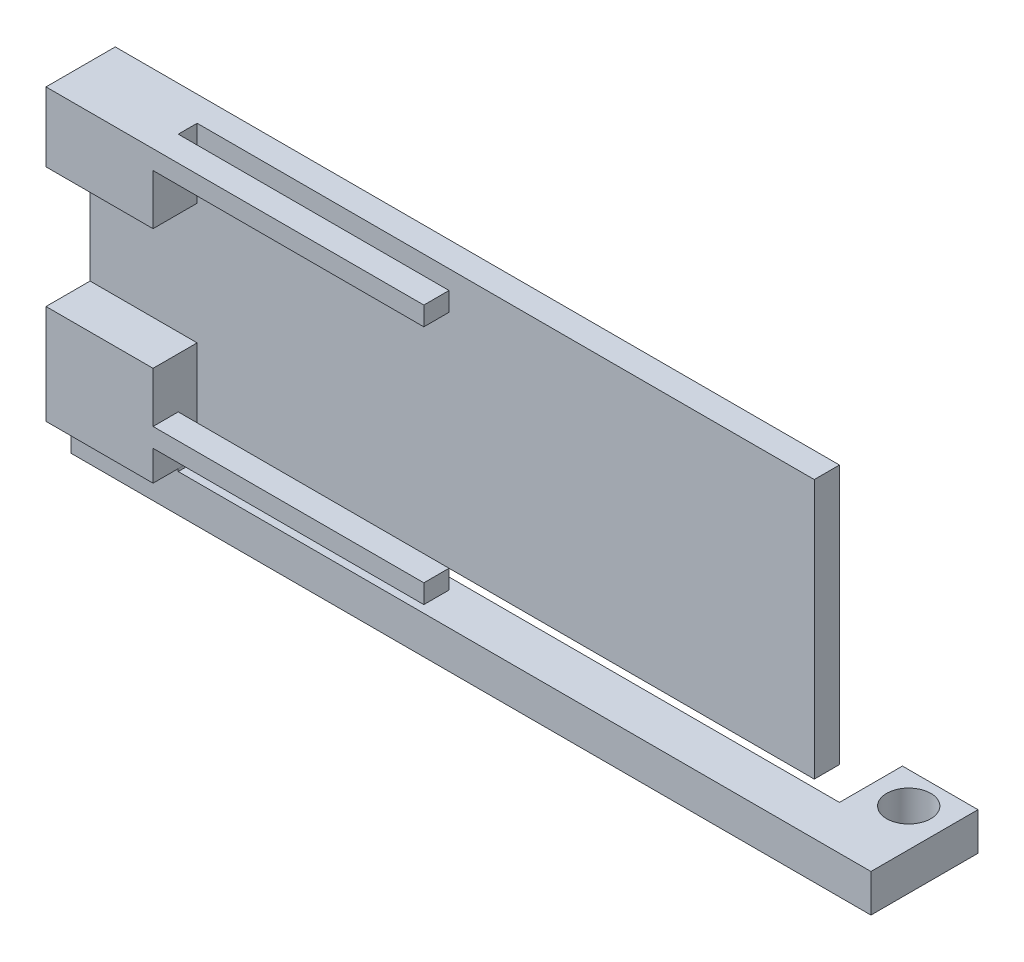
ISO-10303-21;
HEADER;
FILE_DESCRIPTION(('STEP AP214'),'2;1');
FILE_NAME('part.step','',(''),(''),'','','');
FILE_SCHEMA(('AUTOMOTIVE_DESIGN { 1 0 10303 214 1 1 1 1 }'));
ENDSEC;
DATA;
#1=APPLICATION_CONTEXT('core data for automotive mechanical design processes');
#2=APPLICATION_PROTOCOL_DEFINITION('international standard','automotive_design',2000,#1);
#3=PRODUCT_CONTEXT('',#1,'mechanical');
#4=PRODUCT('Part','Part','',(#3));
#5=PRODUCT_RELATED_PRODUCT_CATEGORY('part','',(#4));
#6=PRODUCT_DEFINITION_FORMATION('','',#4);
#7=PRODUCT_DEFINITION_CONTEXT('part definition',#1,'design');
#8=PRODUCT_DEFINITION('design','',#6,#7);
#9=PRODUCT_DEFINITION_SHAPE('','',#8);
#10=(LENGTH_UNIT() NAMED_UNIT(*) SI_UNIT(.MILLI.,.METRE.));
#11=(NAMED_UNIT(*) PLANE_ANGLE_UNIT() SI_UNIT($,.RADIAN.));
#12=(NAMED_UNIT(*) SI_UNIT($,.STERADIAN.) SOLID_ANGLE_UNIT());
#13=UNCERTAINTY_MEASURE_WITH_UNIT(LENGTH_MEASURE(1.E-05),#10,'distance_accuracy_value','');
#14=(GEOMETRIC_REPRESENTATION_CONTEXT(3) GLOBAL_UNCERTAINTY_ASSIGNED_CONTEXT((#13)) GLOBAL_UNIT_ASSIGNED_CONTEXT((#10,
#11,#12)) REPRESENTATION_CONTEXT('',''));
#15=CARTESIAN_POINT('',(0.,0.,0.));
#16=DIRECTION('',(0.,0.,1.));
#17=DIRECTION('',(1.,0.,0.));
#18=AXIS2_PLACEMENT_3D('',#15,#16,#17);
#19=CARTESIAN_POINT('',(0.,0.,0.));
#20=DIRECTION('',(0.,0.,1.));
#21=DIRECTION('',(1.,0.,0.));
#22=AXIS2_PLACEMENT_3D('',#19,#20,#21);
#23=PLANE('',#22);
#24=DIRECTION('',(0.,1.,0.));
#25=VECTOR('',#24,1.);
#26=CARTESIAN_POINT('',(32.9165410472493,-18.2131355932203,0.));
#27=LINE('',#26,#25);
#28=CARTESIAN_POINT('',(32.9165410472493,-18.2131355932203,0.));
#29=VERTEX_POINT('',#28);
#30=CARTESIAN_POINT('',(32.9165410472493,-15.2131355932203,0.));
#31=VERTEX_POINT('',#30);
#32=EDGE_CURVE('E155',#29,#31,#27,.T.);
#33=ORIENTED_EDGE('',*,*,#32,.F.);
#34=DIRECTION('',(-1.,0.,0.));
#35=VECTOR('',#34,1.);
#36=CARTESIAN_POINT('',(-24.5834589527507,-18.2131355932203,0.));
#37=LINE('',#36,#35);
#38=CARTESIAN_POINT('',(-16.0834589527507,-18.2131355932203,0.));
#39=VERTEX_POINT('',#38);
#40=EDGE_CURVE('E70',#29,#39,#37,.T.);
#41=ORIENTED_EDGE('',*,*,#40,.T.);
#42=DIRECTION('',(0.,-1.,0.));
#43=VECTOR('',#42,1.);
#44=CARTESIAN_POINT('',(-16.0834589527507,-18.2131355932203,0.));
#45=LINE('',#44,#43);
#46=CARTESIAN_POINT('',(-16.0834589527507,-15.2131355932203,0.));
#47=VERTEX_POINT('',#46);
#48=EDGE_CURVE('E173',#47,#39,#45,.T.);
#49=ORIENTED_EDGE('',*,*,#48,.F.);
#50=DIRECTION('',(1.,0.,0.));
#51=VECTOR('',#50,1.);
#52=CARTESIAN_POINT('',(-16.0834589527507,-15.2131355932203,0.));
#53=LINE('',#52,#51);
#54=EDGE_CURVE('E65',#47,#31,#53,.T.);
#55=ORIENTED_EDGE('',*,*,#54,.T.);
#56=EDGE_LOOP('',(#33,#41,#49,#55));
#57=FACE_BOUND('',#56,.T.);
#58=ADVANCED_FACE('F49',(#57),#23,.F.);
#59=DIRECTION('',(1.,0.,0.));
#60=VECTOR('',#59,1.);
#61=CARTESIAN_POINT('',(-24.5834589527507,-15.2131355932203,0.));
#62=LINE('',#61,#60);
#63=CARTESIAN_POINT('',(-24.5834589527507,-15.2131355932203,0.));
#64=VERTEX_POINT('',#63);
#65=EDGE_CURVE('E168',#64,#47,#62,.T.);
#66=ORIENTED_EDGE('',*,*,#65,.F.);
#67=DIRECTION('',(0.,1.,0.));
#68=VECTOR('',#67,1.);
#69=CARTESIAN_POINT('',(-24.5834589527507,-15.2131355932203,0.));
#70=LINE('',#69,#68);
#71=CARTESIAN_POINT('',(-24.5834589527507,-15.0131355932203,0.));
#72=VERTEX_POINT('',#71);
#73=EDGE_CURVE('E193',#64,#72,#70,.T.);
#74=ORIENTED_EDGE('',*,*,#73,.T.);
#75=DIRECTION('',(1.,0.,0.));
#76=VECTOR('',#75,1.);
#77=CARTESIAN_POINT('',(-16.0834589527507,-15.0131355932203,0.));
#78=LINE('',#77,#76);
#79=CARTESIAN_POINT('',(-16.0834589527507,-15.0131355932203,0.));
#80=VERTEX_POINT('',#79);
#81=EDGE_CURVE('E195',#72,#80,#78,.T.);
#82=ORIENTED_EDGE('',*,*,#81,.T.);
#83=DIRECTION('',(0.,-1.,0.));
#84=VECTOR('',#83,1.);
#85=CARTESIAN_POINT('',(-16.0834589527507,-15.0131355932203,0.));
#86=LINE('',#85,#84);
#87=EDGE_CURVE('E198',#80,#47,#86,.T.);
#88=ORIENTED_EDGE('',*,*,#87,.T.);
#89=EDGE_LOOP('',(#66,#74,#82,#88));
#90=FACE_BOUND('',#89,.T.);
#91=ADVANCED_FACE('F235',(#90),#23,.F.);
#92=CARTESIAN_POINT('',(-16.0834589527507,-15.0131355932203,0.));
#93=DIRECTION('',(0.,-1.,0.));
#94=DIRECTION('',(0.,0.,-1.));
#95=AXIS2_PLACEMENT_3D('',#92,#93,#94);
#96=PLANE('',#95);
#97=DIRECTION('',(1.,0.,0.));
#98=VECTOR('',#97,1.);
#99=CARTESIAN_POINT('',(-16.0834589527507,-15.0131355932203,3.5));
#100=LINE('',#99,#98);
#101=CARTESIAN_POINT('',(-24.5834589527507,-15.0131355932203,3.5));
#102=VERTEX_POINT('',#101);
#103=CARTESIAN_POINT('',(-16.0834589527507,-15.0131355932203,3.5));
#104=VERTEX_POINT('',#103);
#105=EDGE_CURVE('E192',#102,#104,#100,.T.);
#106=ORIENTED_EDGE('',*,*,#105,.T.);
#107=DIRECTION('',(0.,0.,1.));
#108=VECTOR('',#107,1.);
#109=CARTESIAN_POINT('',(-16.0834589527507,-15.0131355932203,0.));
#110=LINE('',#109,#108);
#111=EDGE_CURVE('E58',#80,#104,#110,.T.);
#112=ORIENTED_EDGE('',*,*,#111,.F.);
#113=ORIENTED_EDGE('',*,*,#81,.F.);
#114=DIRECTION('',(0.,0.,1.));
#115=VECTOR('',#114,1.);
#116=CARTESIAN_POINT('',(-24.5834589527507,-15.0131355932203,0.));
#117=LINE('',#116,#115);
#118=EDGE_CURVE('E12',#72,#102,#117,.T.);
#119=ORIENTED_EDGE('',*,*,#118,.T.);
#120=EDGE_LOOP('',(#106,#112,#113,#119));
#121=FACE_BOUND('',#120,.T.);
#122=ADVANCED_FACE('F51',(#121),#96,.F.);
#123=CARTESIAN_POINT('',(-16.0834589527507,-15.0131355932203,0.));
#124=DIRECTION('',(-1.,0.,0.));
#125=DIRECTION('',(0.,0.,1.));
#126=AXIS2_PLACEMENT_3D('',#123,#124,#125);
#127=PLANE('',#126);
#128=DIRECTION('',(0.,-1.,0.));
#129=VECTOR('',#128,1.);
#130=CARTESIAN_POINT('',(-16.0834589527507,-15.0131355932203,3.5));
#131=LINE('',#130,#129);
#132=CARTESIAN_POINT('',(-16.0834589527507,-15.2131355932203,3.5));
#133=VERTEX_POINT('',#132);
#134=EDGE_CURVE('E204',#104,#133,#131,.T.);
#135=ORIENTED_EDGE('',*,*,#134,.T.);
#136=DIRECTION('',(0.,0.,1.));
#137=VECTOR('',#136,1.);
#138=CARTESIAN_POINT('',(-16.0834589527507,-15.2131355932203,0.));
#139=LINE('',#138,#137);
#140=EDGE_CURVE('E215',#47,#133,#139,.T.);
#141=ORIENTED_EDGE('',*,*,#140,.F.);
#142=ORIENTED_EDGE('',*,*,#87,.F.);
#143=ORIENTED_EDGE('',*,*,#111,.T.);
#144=EDGE_LOOP('',(#135,#141,#142,#143));
#145=FACE_BOUND('',#144,.T.);
#146=ADVANCED_FACE('F223',(#145),#127,.F.);
#147=CARTESIAN_POINT('',(-16.0834589527507,-15.2131355932203,0.));
#148=DIRECTION('',(0.,-1.,0.));
#149=DIRECTION('',(1.,0.,0.));
#150=AXIS2_PLACEMENT_3D('',#147,#148,#149);
#151=PLANE('',#150);
#152=CARTESIAN_POINT('',(35.9165410472493,-15.2131355932203,-2.5));
#153=DIRECTION('',(0.,1.,0.));
#154=DIRECTION('',(0.,0.,1.));
#155=AXIS2_PLACEMENT_3D('',#152,#153,#154);
#156=CIRCLE('',#155,1.75);
#157=CARTESIAN_POINT('',(35.9165410472493,-15.2131355932203,-0.749999999999994));
#158=VERTEX_POINT('',#157);
#159=EDGE_CURVE('E279',#158,#158,#156,.T.);
#160=ORIENTED_EDGE('',*,*,#159,.F.);
#161=EDGE_LOOP('',(#160));
#162=FACE_BOUND('',#161,.T.);
#163=DIRECTION('',(1.,0.,0.));
#164=VECTOR('',#163,1.);
#165=CARTESIAN_POINT('',(-16.0834589527507,-15.2131355932203,3.5));
#166=LINE('',#165,#164);
#167=CARTESIAN_POINT('',(38.9165410472493,-15.2131355932203,3.5));
#168=VERTEX_POINT('',#167);
#169=EDGE_CURVE('E206',#133,#168,#166,.T.);
#170=ORIENTED_EDGE('',*,*,#169,.T.);
#171=DIRECTION('',(0.,0.,1.));
#172=VECTOR('',#171,1.);
#173=CARTESIAN_POINT('',(38.9165410472493,-15.2131355932203,0.));
#174=LINE('',#173,#172);
#175=CARTESIAN_POINT('',(38.9165410472493,-15.2131355932203,-5.));
#176=VERTEX_POINT('',#175);
#177=EDGE_CURVE('E139',#176,#168,#174,.T.);
#178=ORIENTED_EDGE('',*,*,#177,.F.);
#179=DIRECTION('',(1.,0.,0.));
#180=VECTOR('',#179,1.);
#181=CARTESIAN_POINT('',(38.9165410472493,-15.2131355932203,-5.));
#182=LINE('',#181,#180);
#183=CARTESIAN_POINT('',(32.9165410472493,-15.2131355932203,-5.));
#184=VERTEX_POINT('',#183);
#185=EDGE_CURVE('E154',#184,#176,#182,.T.);
#186=ORIENTED_EDGE('',*,*,#185,.F.);
#187=DIRECTION('',(0.,0.,1.));
#188=VECTOR('',#187,1.);
#189=CARTESIAN_POINT('',(32.9165410472493,-15.2131355932203,-5.));
#190=LINE('',#189,#188);
#191=EDGE_CURVE('E163',#184,#31,#190,.T.);
#192=ORIENTED_EDGE('',*,*,#191,.T.);
#193=ORIENTED_EDGE('',*,*,#54,.F.);
#194=ORIENTED_EDGE('',*,*,#140,.T.);
#195=EDGE_LOOP('',(#170,#178,#186,#192,#193,#194));
#196=FACE_BOUND('',#195,.T.);
#197=ADVANCED_FACE('F233',(#162,#196),#151,.F.);
#198=CARTESIAN_POINT('',(38.9165410472493,-15.2131355932203,0.));
#199=DIRECTION('',(-1.,0.,0.));
#200=DIRECTION('',(0.,-1.,0.));
#201=AXIS2_PLACEMENT_3D('',#198,#199,#200);
#202=PLANE('',#201);
#203=DIRECTION('',(0.,-1.,0.));
#204=VECTOR('',#203,1.);
#205=CARTESIAN_POINT('',(38.9165410472493,-15.2131355932203,3.5));
#206=LINE('',#205,#204);
#207=CARTESIAN_POINT('',(38.9165410472493,-18.2131355932203,3.5));
#208=VERTEX_POINT('',#207);
#209=EDGE_CURVE('E136',#168,#208,#206,.T.);
#210=ORIENTED_EDGE('',*,*,#209,.T.);
#211=DIRECTION('',(0.,0.,1.));
#212=VECTOR('',#211,1.);
#213=CARTESIAN_POINT('',(38.9165410472493,-18.2131355932203,0.));
#214=LINE('',#213,#212);
#215=CARTESIAN_POINT('',(38.9165410472493,-18.2131355932203,-5.));
#216=VERTEX_POINT('',#215);
#217=EDGE_CURVE('E129',#216,#208,#214,.T.);
#218=ORIENTED_EDGE('',*,*,#217,.F.);
#219=DIRECTION('',(0.,-1.,0.));
#220=VECTOR('',#219,1.);
#221=CARTESIAN_POINT('',(38.9165410472493,-18.2131355932203,-5.));
#222=LINE('',#221,#220);
#223=EDGE_CURVE('E134',#176,#216,#222,.T.);
#224=ORIENTED_EDGE('',*,*,#223,.F.);
#225=ORIENTED_EDGE('',*,*,#177,.T.);
#226=EDGE_LOOP('',(#210,#218,#224,#225));
#227=FACE_BOUND('',#226,.T.);
#228=ADVANCED_FACE('F131',(#227),#202,.F.);
#229=CARTESIAN_POINT('',(-24.5834589527507,-18.2131355932203,0.));
#230=DIRECTION('',(0.,1.,0.));
#231=DIRECTION('',(-1.,0.,0.));
#232=AXIS2_PLACEMENT_3D('',#229,#230,#231);
#233=PLANE('',#232);
#234=CARTESIAN_POINT('',(35.9165410472493,-18.2131355932203,-2.5));
#235=DIRECTION('',(0.,1.,0.));
#236=DIRECTION('',(-1.,0.,0.));
#237=AXIS2_PLACEMENT_3D('',#234,#235,#236);
#238=CIRCLE('',#237,1.75);
#239=CARTESIAN_POINT('',(34.1665410472493,-18.2131355932203,-2.5));
#240=VERTEX_POINT('',#239);
#241=EDGE_CURVE('E53',#240,#240,#238,.T.);
#242=ORIENTED_EDGE('',*,*,#241,.T.);
#243=EDGE_LOOP('',(#242));
#244=FACE_BOUND('',#243,.T.);
#245=CARTESIAN_POINT('',(-20.3334589527507,-18.2131355932203,-2.5));
#246=DIRECTION('',(0.,1.,0.));
#247=DIRECTION('',(-1.,0.,0.));
#248=AXIS2_PLACEMENT_3D('',#245,#246,#247);
#249=CIRCLE('',#248,1.75);
#250=CARTESIAN_POINT('',(-22.0834589527507,-18.2131355932203,-2.5));
#251=VERTEX_POINT('',#250);
#252=EDGE_CURVE('E159',#251,#251,#249,.T.);
#253=ORIENTED_EDGE('',*,*,#252,.T.);
#254=EDGE_LOOP('',(#253));
#255=FACE_BOUND('',#254,.T.);
#256=DIRECTION('',(-1.,0.,0.));
#257=VECTOR('',#256,1.);
#258=CARTESIAN_POINT('',(-24.5834589527507,-18.2131355932203,3.5));
#259=LINE('',#258,#257);
#260=CARTESIAN_POINT('',(-24.5834589527507,-18.2131355932203,3.5));
#261=VERTEX_POINT('',#260);
#262=EDGE_CURVE('E209',#208,#261,#259,.T.);
#263=ORIENTED_EDGE('',*,*,#262,.T.);
#264=DIRECTION('',(0.,0.,1.));
#265=VECTOR('',#264,1.);
#266=CARTESIAN_POINT('',(-24.5834589527507,-18.2131355932203,0.));
#267=LINE('',#266,#265);
#268=CARTESIAN_POINT('',(-24.5834589527507,-18.2131355932203,-5.));
#269=VERTEX_POINT('',#268);
#270=EDGE_CURVE('E140',#269,#261,#267,.T.);
#271=ORIENTED_EDGE('',*,*,#270,.F.);
#272=DIRECTION('',(-1.,0.,0.));
#273=VECTOR('',#272,1.);
#274=CARTESIAN_POINT('',(-24.5834589527507,-18.2131355932203,-5.));
#275=LINE('',#274,#273);
#276=CARTESIAN_POINT('',(-16.0834589527507,-18.2131355932203,-5.));
#277=VERTEX_POINT('',#276);
#278=EDGE_CURVE('E177',#277,#269,#275,.T.);
#279=ORIENTED_EDGE('',*,*,#278,.F.);
#280=DIRECTION('',(0.,0.,1.));
#281=VECTOR('',#280,1.);
#282=CARTESIAN_POINT('',(-16.0834589527507,-18.2131355932203,-5.));
#283=LINE('',#282,#281);
#284=EDGE_CURVE('E180',#277,#39,#283,.T.);
#285=ORIENTED_EDGE('',*,*,#284,.T.);
#286=ORIENTED_EDGE('',*,*,#40,.F.);
#287=DIRECTION('',(0.,0.,1.));
#288=VECTOR('',#287,1.);
#289=CARTESIAN_POINT('',(32.9165410472493,-18.2131355932203,-5.));
#290=LINE('',#289,#288);
#291=CARTESIAN_POINT('',(32.9165410472493,-18.2131355932203,-5.));
#292=VERTEX_POINT('',#291);
#293=EDGE_CURVE('E146',#292,#29,#290,.T.);
#294=ORIENTED_EDGE('',*,*,#293,.F.);
#295=DIRECTION('',(-1.,0.,0.));
#296=VECTOR('',#295,1.);
#297=CARTESIAN_POINT('',(38.9165410472493,-18.2131355932203,-5.));
#298=LINE('',#297,#296);
#299=EDGE_CURVE('E143',#216,#292,#298,.T.);
#300=ORIENTED_EDGE('',*,*,#299,.F.);
#301=ORIENTED_EDGE('',*,*,#217,.T.);
#302=EDGE_LOOP('',(#263,#271,#279,#285,#286,#294,#300,#301));
#303=FACE_BOUND('',#302,.T.);
#304=ADVANCED_FACE('F144',(#244,#255,#303),#233,.F.);
#305=CARTESIAN_POINT('',(-24.5834589527507,-15.2131355932203,0.));
#306=DIRECTION('',(1.,0.,0.));
#307=DIRECTION('',(0.,0.,-1.));
#308=AXIS2_PLACEMENT_3D('',#305,#306,#307);
#309=PLANE('',#308);
#310=DIRECTION('',(0.,1.,0.));
#311=VECTOR('',#310,1.);
#312=CARTESIAN_POINT('',(-24.5834589527507,-15.2131355932203,3.5));
#313=LINE('',#312,#311);
#314=EDGE_CURVE('E196',#261,#102,#313,.T.);
#315=ORIENTED_EDGE('',*,*,#314,.T.);
#316=ORIENTED_EDGE('',*,*,#118,.F.);
#317=ORIENTED_EDGE('',*,*,#73,.F.);
#318=DIRECTION('',(0.,0.,1.));
#319=VECTOR('',#318,1.);
#320=CARTESIAN_POINT('',(-24.5834589527507,-15.2131355932203,-5.));
#321=LINE('',#320,#319);
#322=CARTESIAN_POINT('',(-24.5834589527507,-15.2131355932203,-5.));
#323=VERTEX_POINT('',#322);
#324=EDGE_CURVE('E189',#323,#64,#321,.T.);
#325=ORIENTED_EDGE('',*,*,#324,.F.);
#326=DIRECTION('',(0.,1.,0.));
#327=VECTOR('',#326,1.);
#328=CARTESIAN_POINT('',(-24.5834589527507,-18.2131355932203,-5.));
#329=LINE('',#328,#327);
#330=EDGE_CURVE('E169',#269,#323,#329,.T.);
#331=ORIENTED_EDGE('',*,*,#330,.F.);
#332=ORIENTED_EDGE('',*,*,#270,.T.);
#333=EDGE_LOOP('',(#315,#316,#317,#325,#331,#332));
#334=FACE_BOUND('',#333,.T.);
#335=ADVANCED_FACE('F250',(#334),#309,.F.);
#336=CARTESIAN_POINT('',(0.,0.,3.5));
#337=DIRECTION('',(0.,0.,1.));
#338=DIRECTION('',(1.,0.,0.));
#339=AXIS2_PLACEMENT_3D('',#336,#337,#338);
#340=PLANE('',#339);
#341=ORIENTED_EDGE('',*,*,#105,.F.);
#342=ORIENTED_EDGE('',*,*,#314,.F.);
#343=ORIENTED_EDGE('',*,*,#262,.F.);
#344=ORIENTED_EDGE('',*,*,#209,.F.);
#345=ORIENTED_EDGE('',*,*,#169,.F.);
#346=ORIENTED_EDGE('',*,*,#134,.F.);
#347=EDGE_LOOP('',(#341,#342,#343,#344,#345,#346));
#348=FACE_BOUND('',#347,.T.);
#349=ADVANCED_FACE('F230',(#348),#340,.T.);
#350=CARTESIAN_POINT('',(-24.5834589527507,-15.2131355932203,-5.));
#351=DIRECTION('',(0.,-1.,0.));
#352=DIRECTION('',(0.,0.,-1.));
#353=AXIS2_PLACEMENT_3D('',#350,#351,#352);
#354=PLANE('',#353);
#355=CARTESIAN_POINT('',(-20.3334589527507,-15.2131355932203,-2.5));
#356=DIRECTION('',(0.,1.,0.));
#357=DIRECTION('',(0.,0.,1.));
#358=AXIS2_PLACEMENT_3D('',#355,#356,#357);
#359=CIRCLE('',#358,1.75);
#360=CARTESIAN_POINT('',(-20.3334589527507,-15.2131355932203,-0.75));
#361=VERTEX_POINT('',#360);
#362=EDGE_CURVE('E281',#361,#361,#359,.T.);
#363=ORIENTED_EDGE('',*,*,#362,.F.);
#364=EDGE_LOOP('',(#363));
#365=FACE_BOUND('',#364,.T.);
#366=ORIENTED_EDGE('',*,*,#65,.T.);
#367=DIRECTION('',(0.,0.,1.));
#368=VECTOR('',#367,1.);
#369=CARTESIAN_POINT('',(-16.0834589527507,-15.2131355932203,-5.));
#370=LINE('',#369,#368);
#371=CARTESIAN_POINT('',(-16.0834589527507,-15.2131355932203,-5.));
#372=VERTEX_POINT('',#371);
#373=EDGE_CURVE('E186',#372,#47,#370,.T.);
#374=ORIENTED_EDGE('',*,*,#373,.F.);
#375=DIRECTION('',(1.,0.,0.));
#376=VECTOR('',#375,1.);
#377=CARTESIAN_POINT('',(-24.5834589527507,-15.2131355932203,-5.));
#378=LINE('',#377,#376);
#379=EDGE_CURVE('E172',#323,#372,#378,.T.);
#380=ORIENTED_EDGE('',*,*,#379,.F.);
#381=ORIENTED_EDGE('',*,*,#324,.T.);
#382=EDGE_LOOP('',(#366,#374,#380,#381));
#383=FACE_BOUND('',#382,.T.);
#384=ADVANCED_FACE('F241',(#365,#383),#354,.F.);
#385=CARTESIAN_POINT('',(-16.0834589527507,-18.2131355932203,-5.));
#386=DIRECTION('',(-1.,0.,0.));
#387=DIRECTION('',(0.,0.,1.));
#388=AXIS2_PLACEMENT_3D('',#385,#386,#387);
#389=PLANE('',#388);
#390=ORIENTED_EDGE('',*,*,#48,.T.);
#391=ORIENTED_EDGE('',*,*,#284,.F.);
#392=DIRECTION('',(0.,-1.,0.));
#393=VECTOR('',#392,1.);
#394=CARTESIAN_POINT('',(-16.0834589527507,-18.2131355932203,-5.));
#395=LINE('',#394,#393);
#396=EDGE_CURVE('E175',#372,#277,#395,.T.);
#397=ORIENTED_EDGE('',*,*,#396,.F.);
#398=ORIENTED_EDGE('',*,*,#373,.T.);
#399=EDGE_LOOP('',(#390,#391,#397,#398));
#400=FACE_BOUND('',#399,.T.);
#401=ADVANCED_FACE('F244',(#400),#389,.F.);
#402=CARTESIAN_POINT('',(0.,0.,-5.));
#403=DIRECTION('',(0.,0.,-1.));
#404=DIRECTION('',(-1.,0.,0.));
#405=AXIS2_PLACEMENT_3D('',#402,#403,#404);
#406=PLANE('',#405);
#407=ORIENTED_EDGE('',*,*,#330,.T.);
#408=ORIENTED_EDGE('',*,*,#379,.T.);
#409=ORIENTED_EDGE('',*,*,#396,.T.);
#410=ORIENTED_EDGE('',*,*,#278,.T.);
#411=EDGE_LOOP('',(#407,#408,#409,#410));
#412=FACE_BOUND('',#411,.T.);
#413=ADVANCED_FACE('F247',(#412),#406,.T.);
#414=CARTESIAN_POINT('',(32.9165410472493,-18.2131355932203,-5.));
#415=DIRECTION('',(1.,0.,0.));
#416=DIRECTION('',(0.,0.,-1.));
#417=AXIS2_PLACEMENT_3D('',#414,#415,#416);
#418=PLANE('',#417);
#419=ORIENTED_EDGE('',*,*,#32,.T.);
#420=ORIENTED_EDGE('',*,*,#191,.F.);
#421=DIRECTION('',(0.,1.,0.));
#422=VECTOR('',#421,1.);
#423=CARTESIAN_POINT('',(32.9165410472493,-18.2131355932203,-5.));
#424=LINE('',#423,#422);
#425=EDGE_CURVE('E149',#292,#184,#424,.T.);
#426=ORIENTED_EDGE('',*,*,#425,.F.);
#427=ORIENTED_EDGE('',*,*,#293,.T.);
#428=EDGE_LOOP('',(#419,#420,#426,#427));
#429=FACE_BOUND('',#428,.T.);
#430=ADVANCED_FACE('F297',(#429),#418,.F.);
#431=CARTESIAN_POINT('',(0.,0.,-5.));
#432=DIRECTION('',(0.,0.,1.));
#433=DIRECTION('',(1.,0.,0.));
#434=AXIS2_PLACEMENT_3D('',#431,#432,#433);
#435=PLANE('',#434);
#436=ORIENTED_EDGE('',*,*,#223,.T.);
#437=ORIENTED_EDGE('',*,*,#299,.T.);
#438=ORIENTED_EDGE('',*,*,#425,.T.);
#439=ORIENTED_EDGE('',*,*,#185,.T.);
#440=EDGE_LOOP('',(#436,#437,#438,#439));
#441=FACE_BOUND('',#440,.T.);
#442=ADVANCED_FACE('F152',(#441),#435,.F.);
#443=CARTESIAN_POINT('',(-20.3334589527507,-20.2131355932203,-2.5));
#444=DIRECTION('',(0.,1.,0.));
#445=DIRECTION('',(0.,0.,1.));
#446=AXIS2_PLACEMENT_3D('',#443,#444,#445);
#447=CYLINDRICAL_SURFACE('',#446,1.75);
#448=ORIENTED_EDGE('',*,*,#362,.T.);
#449=EDGE_LOOP('',(#448));
#450=FACE_BOUND('',#449,.T.);
#451=ORIENTED_EDGE('',*,*,#252,.F.);
#452=EDGE_LOOP('',(#451));
#453=FACE_BOUND('',#452,.T.);
#454=ADVANCED_FACE('F287',(#450,#453),#447,.F.);
#455=CARTESIAN_POINT('',(35.9165410472493,-20.2131355932203,-2.5));
#456=DIRECTION('',(0.,1.,0.));
#457=DIRECTION('',(0.,0.,1.));
#458=AXIS2_PLACEMENT_3D('',#455,#456,#457);
#459=CYLINDRICAL_SURFACE('',#458,1.75);
#460=ORIENTED_EDGE('',*,*,#159,.T.);
#461=EDGE_LOOP('',(#460));
#462=FACE_BOUND('',#461,.T.);
#463=ORIENTED_EDGE('',*,*,#241,.F.);
#464=EDGE_LOOP('',(#463));
#465=FACE_BOUND('',#464,.T.);
#466=ADVANCED_FACE('F307',(#462,#465),#459,.F.);
#467=CLOSED_SHELL('',(#58,#91,#122,#146,#197,#228,#304,#335,#349,#384,#401,#413,#430,#442,#454,#466));
#468=MANIFOLD_SOLID_BREP('B2',#467);
#469=CARTESIAN_POINT('',(0.,0.,2.));
#470=DIRECTION('',(0.,0.,1.));
#471=DIRECTION('',(1.,0.,0.));
#472=AXIS2_PLACEMENT_3D('',#469,#470,#471);
#473=PLANE('',#472);
#474=DIRECTION('',(0.,-1.,0.));
#475=VECTOR('',#474,1.);
#476=CARTESIAN_POINT('',(-24.5834589527507,-12.6131355932203,2.));
#477=LINE('',#476,#475);
#478=CARTESIAN_POINT('',(-24.5834589527507,2.48686440677966,2.));
#479=VERTEX_POINT('',#478);
#480=CARTESIAN_POINT('',(-24.5834589527507,-7.11313559322034,2.));
#481=VERTEX_POINT('',#480);
#482=EDGE_CURVE('E592',#479,#481,#477,.T.);
#483=ORIENTED_EDGE('',*,*,#482,.T.);
#484=DIRECTION('',(1.,0.,0.));
#485=VECTOR('',#484,1.);
#486=CARTESIAN_POINT('',(-19.5834589527507,-7.11313559322034,2.));
#487=LINE('',#486,#485);
#488=CARTESIAN_POINT('',(-16.0834589527507,-7.11313559322034,2.));
#489=VERTEX_POINT('',#488);
#490=EDGE_CURVE('E446',#481,#489,#487,.T.);
#491=ORIENTED_EDGE('',*,*,#490,.T.);
#492=DIRECTION('',(0.,1.,0.));
#493=VECTOR('',#492,1.);
#494=CARTESIAN_POINT('',(-16.0834589527507,7.98686440677966,2.));
#495=LINE('',#494,#493);
#496=CARTESIAN_POINT('',(-16.0834589527507,-12.6131355932203,2.));
#497=VERTEX_POINT('',#496);
#498=EDGE_CURVE('E697',#497,#489,#495,.T.);
#499=ORIENTED_EDGE('',*,*,#498,.F.);
#500=DIRECTION('',(1.,0.,0.));
#501=VECTOR('',#500,1.);
#502=CARTESIAN_POINT('',(-19.5834589527507,-12.6131355932203,2.));
#503=LINE('',#502,#501);
#504=CARTESIAN_POINT('',(32.9165410472493,-12.6131355932203,2.));
#505=VERTEX_POINT('',#504);
#506=EDGE_CURVE('E710',#497,#505,#503,.T.);
#507=ORIENTED_EDGE('',*,*,#506,.T.);
#508=DIRECTION('',(0.,1.,0.));
#509=VECTOR('',#508,1.);
#510=CARTESIAN_POINT('',(32.9165410472493,7.98686440677966,2.));
#511=LINE('',#510,#509);
#512=CARTESIAN_POINT('',(32.9165410472493,7.98686440677966,2.));
#513=VERTEX_POINT('',#512);
#514=EDGE_CURVE('E713',#505,#513,#511,.T.);
#515=ORIENTED_EDGE('',*,*,#514,.T.);
#516=DIRECTION('',(-1.,0.,0.));
#517=VECTOR('',#516,1.);
#518=CARTESIAN_POINT('',(-19.5834589527507,7.98686440677966,2.));
#519=LINE('',#518,#517);
#520=CARTESIAN_POINT('',(-16.0834589527507,7.98686440677966,2.));
#521=VERTEX_POINT('',#520);
#522=EDGE_CURVE('E717',#513,#521,#519,.T.);
#523=ORIENTED_EDGE('',*,*,#522,.T.);
#524=CARTESIAN_POINT('',(-16.0834589527507,2.48686440677966,2.));
#525=VERTEX_POINT('',#524);
#526=EDGE_CURVE('E691',#525,#521,#495,.T.);
#527=ORIENTED_EDGE('',*,*,#526,.F.);
#528=DIRECTION('',(-1.,0.,0.));
#529=VECTOR('',#528,1.);
#530=CARTESIAN_POINT('',(-19.5834589527507,2.48686440677966,2.));
#531=LINE('',#530,#529);
#532=EDGE_CURVE('E682',#525,#479,#531,.T.);
#533=ORIENTED_EDGE('',*,*,#532,.T.);
#534=EDGE_LOOP('',(#483,#491,#499,#507,#515,#523,#527,#533));
#535=FACE_BOUND('',#534,.T.);
#536=ADVANCED_FACE('F422',(#535),#473,.T.);
#537=CARTESIAN_POINT('',(-19.5834589527507,-12.6131355932203,2.));
#538=DIRECTION('',(0.,1.,0.));
#539=DIRECTION('',(0.,0.,1.));
#540=AXIS2_PLACEMENT_3D('',#537,#538,#539);
#541=PLANE('',#540);
#542=DIRECTION('',(0.,0.,-1.));
#543=VECTOR('',#542,1.);
#544=CARTESIAN_POINT('',(-16.0834589527507,-12.6131355932203,5.5));
#545=LINE('',#544,#543);
#546=CARTESIAN_POINT('',(-16.0834589527507,-12.6131355932203,5.5));
#547=VERTEX_POINT('',#546);
#548=CARTESIAN_POINT('',(-16.0834589527507,-12.6131355932203,3.5));
#549=VERTEX_POINT('',#548);
#550=EDGE_CURVE('E569',#547,#549,#545,.T.);
#551=ORIENTED_EDGE('',*,*,#550,.T.);
#552=DIRECTION('',(-1.,0.,0.));
#553=VECTOR('',#552,1.);
#554=CARTESIAN_POINT('',(5.41654104724932,-12.6131355932203,3.5));
#555=LINE('',#554,#553);
#556=CARTESIAN_POINT('',(5.41654104724932,-12.6131355932203,3.5));
#557=VERTEX_POINT('',#556);
#558=EDGE_CURVE('E646',#557,#549,#555,.T.);
#559=ORIENTED_EDGE('',*,*,#558,.F.);
#560=DIRECTION('',(0.,0.,-1.));
#561=VECTOR('',#560,1.);
#562=CARTESIAN_POINT('',(5.41654104724932,-12.6131355932203,5.5));
#563=LINE('',#562,#561);
#564=CARTESIAN_POINT('',(5.41654104724932,-12.6131355932203,5.5));
#565=VERTEX_POINT('',#564);
#566=EDGE_CURVE('E624',#565,#557,#563,.T.);
#567=ORIENTED_EDGE('',*,*,#566,.F.);
#568=DIRECTION('',(1.,0.,0.));
#569=VECTOR('',#568,1.);
#570=CARTESIAN_POINT('',(-19.5834589527507,-12.6131355932203,5.5));
#571=LINE('',#570,#569);
#572=EDGE_CURVE('E438',#547,#565,#571,.T.);
#573=ORIENTED_EDGE('',*,*,#572,.F.);
#574=EDGE_LOOP('',(#551,#559,#567,#573));
#575=FACE_BOUND('',#574,.T.);
#576=ADVANCED_FACE('F424',(#575),#541,.F.);
#577=ORIENTED_EDGE('',*,*,#506,.F.);
#578=DIRECTION('',(0.,0.,1.));
#579=VECTOR('',#578,1.);
#580=CARTESIAN_POINT('',(-16.0834589527507,-12.6131355932203,0.));
#581=LINE('',#580,#579);
#582=CARTESIAN_POINT('',(-16.0834589527507,-12.6131355932203,0.));
#583=VERTEX_POINT('',#582);
#584=EDGE_CURVE('E607',#583,#497,#581,.T.);
#585=ORIENTED_EDGE('',*,*,#584,.F.);
#586=DIRECTION('',(1.,0.,0.));
#587=VECTOR('',#586,1.);
#588=CARTESIAN_POINT('',(-19.5834589527507,-12.6131355932203,0.));
#589=LINE('',#588,#587);
#590=CARTESIAN_POINT('',(32.9165410472493,-12.6131355932203,0.));
#591=VERTEX_POINT('',#590);
#592=EDGE_CURVE('E709',#583,#591,#589,.T.);
#593=ORIENTED_EDGE('',*,*,#592,.T.);
#594=DIRECTION('',(0.,0.,-1.));
#595=VECTOR('',#594,1.);
#596=CARTESIAN_POINT('',(32.9165410472493,-12.6131355932203,2.));
#597=LINE('',#596,#595);
#598=EDGE_CURVE('E47',#505,#591,#597,.T.);
#599=ORIENTED_EDGE('',*,*,#598,.F.);
#600=EDGE_LOOP('',(#577,#585,#593,#599));
#601=FACE_BOUND('',#600,.T.);
#602=ADVANCED_FACE('F796',(#601),#541,.F.);
#603=CARTESIAN_POINT('',(-16.0834589527507,7.98686440677966,5.5));
#604=DIRECTION('',(-1.,0.,0.));
#605=DIRECTION('',(0.,-1.,0.));
#606=AXIS2_PLACEMENT_3D('',#603,#604,#605);
#607=PLANE('',#606);
#608=DIRECTION('',(0.,1.,0.));
#609=VECTOR('',#608,1.);
#610=CARTESIAN_POINT('',(-16.0834589527507,-12.6131355932203,3.5));
#611=LINE('',#610,#609);
#612=CARTESIAN_POINT('',(-16.0834589527507,-11.1131355932203,3.5));
#613=VERTEX_POINT('',#612);
#614=EDGE_CURVE('E611',#549,#613,#611,.T.);
#615=ORIENTED_EDGE('',*,*,#614,.F.);
#616=ORIENTED_EDGE('',*,*,#550,.F.);
#617=DIRECTION('',(0.,1.,0.));
#618=VECTOR('',#617,1.);
#619=CARTESIAN_POINT('',(-16.0834589527507,-15.0131355932203,5.5));
#620=LINE('',#619,#618);
#621=CARTESIAN_POINT('',(-16.0834589527507,-15.0131355932203,5.5));
#622=VERTEX_POINT('',#621);
#623=EDGE_CURVE('E578',#622,#547,#620,.T.);
#624=ORIENTED_EDGE('',*,*,#623,.F.);
#625=DIRECTION('',(0.,0.,1.));
#626=VECTOR('',#625,1.);
#627=CARTESIAN_POINT('',(-16.0834589527507,-15.0131355932203,0.));
#628=LINE('',#627,#626);
#629=CARTESIAN_POINT('',(-16.0834589527507,-15.0131355932203,0.));
#630=VERTEX_POINT('',#629);
#631=EDGE_CURVE('E612',#630,#622,#628,.T.);
#632=ORIENTED_EDGE('',*,*,#631,.F.);
#633=DIRECTION('',(0.,1.,0.));
#634=VECTOR('',#633,1.);
#635=CARTESIAN_POINT('',(-16.0834589527507,-12.6131355932203,0.));
#636=LINE('',#635,#634);
#637=EDGE_CURVE('E600',#630,#583,#636,.T.);
#638=ORIENTED_EDGE('',*,*,#637,.T.);
#639=ORIENTED_EDGE('',*,*,#584,.T.);
#640=ORIENTED_EDGE('',*,*,#498,.T.);
#641=DIRECTION('',(0.,0.,1.));
#642=VECTOR('',#641,1.);
#643=CARTESIAN_POINT('',(-16.0834589527507,-7.11313559322034,2.));
#644=LINE('',#643,#642);
#645=CARTESIAN_POINT('',(-16.0834589527507,-7.11313559322034,5.5));
#646=VERTEX_POINT('',#645);
#647=EDGE_CURVE('E684',#489,#646,#644,.T.);
#648=ORIENTED_EDGE('',*,*,#647,.T.);
#649=DIRECTION('',(0.,1.,0.));
#650=VECTOR('',#649,1.);
#651=CARTESIAN_POINT('',(-16.0834589527507,7.98686440677966,5.5));
#652=LINE('',#651,#650);
#653=CARTESIAN_POINT('',(-16.0834589527507,-11.1131355932203,5.5));
#654=VERTEX_POINT('',#653);
#655=EDGE_CURVE('E556',#654,#646,#652,.T.);
#656=ORIENTED_EDGE('',*,*,#655,.F.);
#657=DIRECTION('',(0.,0.,1.));
#658=VECTOR('',#657,1.);
#659=CARTESIAN_POINT('',(-16.0834589527507,-11.1131355932203,5.5));
#660=LINE('',#659,#658);
#661=EDGE_CURVE('E625',#613,#654,#660,.T.);
#662=ORIENTED_EDGE('',*,*,#661,.F.);
#663=EDGE_LOOP('',(#615,#616,#624,#632,#638,#639,#640,#648,#656,#662));
#664=FACE_BOUND('',#663,.T.);
#665=ADVANCED_FACE('F750',(#664),#607,.F.);
#666=DIRECTION('',(0.,0.,-1.));
#667=VECTOR('',#666,1.);
#668=CARTESIAN_POINT('',(-16.0834589527507,6.48686440677966,5.5));
#669=LINE('',#668,#667);
#670=CARTESIAN_POINT('',(-16.0834589527507,6.48686440677966,5.5));
#671=VERTEX_POINT('',#670);
#672=CARTESIAN_POINT('',(-16.0834589527507,6.48686440677966,3.5));
#673=VERTEX_POINT('',#672);
#674=EDGE_CURVE('E650',#671,#673,#669,.T.);
#675=ORIENTED_EDGE('',*,*,#674,.F.);
#676=CARTESIAN_POINT('',(-16.0834589527507,2.48686440677966,5.5));
#677=VERTEX_POINT('',#676);
#678=EDGE_CURVE('E696',#677,#671,#652,.T.);
#679=ORIENTED_EDGE('',*,*,#678,.F.);
#680=DIRECTION('',(0.,0.,1.));
#681=VECTOR('',#680,1.);
#682=CARTESIAN_POINT('',(-16.0834589527507,2.48686440677966,2.));
#683=LINE('',#682,#681);
#684=EDGE_CURVE('E688',#525,#677,#683,.T.);
#685=ORIENTED_EDGE('',*,*,#684,.F.);
#686=ORIENTED_EDGE('',*,*,#526,.T.);
#687=DIRECTION('',(0.,0.,-1.));
#688=VECTOR('',#687,1.);
#689=CARTESIAN_POINT('',(-16.0834589527507,7.98686440677966,5.5));
#690=LINE('',#689,#688);
#691=CARTESIAN_POINT('',(-16.0834589527507,7.98686440677966,3.5));
#692=VERTEX_POINT('',#691);
#693=EDGE_CURVE('E703',#692,#521,#690,.T.);
#694=ORIENTED_EDGE('',*,*,#693,.F.);
#695=DIRECTION('',(0.,1.,0.));
#696=VECTOR('',#695,1.);
#697=CARTESIAN_POINT('',(-16.0834589527507,7.98686440677966,3.5));
#698=LINE('',#697,#696);
#699=EDGE_CURVE('E656',#673,#692,#698,.T.);
#700=ORIENTED_EDGE('',*,*,#699,.F.);
#701=EDGE_LOOP('',(#675,#679,#685,#686,#694,#700));
#702=FACE_BOUND('',#701,.T.);
#703=ADVANCED_FACE('F791',(#702),#607,.F.);
#704=CARTESIAN_POINT('',(0.,0.,5.5));
#705=DIRECTION('',(0.,0.,1.));
#706=DIRECTION('',(1.,0.,0.));
#707=AXIS2_PLACEMENT_3D('',#704,#705,#706);
#708=PLANE('',#707);
#709=DIRECTION('',(-1.,0.,0.));
#710=VECTOR('',#709,1.);
#711=CARTESIAN_POINT('',(-19.5834589527507,2.48686440677966,5.5));
#712=LINE('',#711,#710);
#713=CARTESIAN_POINT('',(-24.5834589527507,2.48686440677966,5.5));
#714=VERTEX_POINT('',#713);
#715=EDGE_CURVE('E559',#677,#714,#712,.T.);
#716=ORIENTED_EDGE('',*,*,#715,.F.);
#717=ORIENTED_EDGE('',*,*,#678,.T.);
#718=DIRECTION('',(-1.,0.,0.));
#719=VECTOR('',#718,1.);
#720=CARTESIAN_POINT('',(5.41654104724931,6.48686440677967,5.5));
#721=LINE('',#720,#719);
#722=CARTESIAN_POINT('',(5.41654104724931,6.48686440677967,5.5));
#723=VERTEX_POINT('',#722);
#724=EDGE_CURVE('E560',#723,#671,#721,.T.);
#725=ORIENTED_EDGE('',*,*,#724,.F.);
#726=DIRECTION('',(0.,-1.,0.));
#727=VECTOR('',#726,1.);
#728=CARTESIAN_POINT('',(5.41654104724931,7.98686440677967,5.5));
#729=LINE('',#728,#727);
#730=CARTESIAN_POINT('',(5.41654104724931,7.98686440677967,5.5));
#731=VERTEX_POINT('',#730);
#732=EDGE_CURVE('E651',#731,#723,#729,.T.);
#733=ORIENTED_EDGE('',*,*,#732,.F.);
#734=DIRECTION('',(-1.,0.,0.));
#735=VECTOR('',#734,1.);
#736=CARTESIAN_POINT('',(-19.5834589527507,7.98686440677966,5.5));
#737=LINE('',#736,#735);
#738=CARTESIAN_POINT('',(-24.5834589527507,7.98686440677966,5.5));
#739=VERTEX_POINT('',#738);
#740=EDGE_CURVE('E700',#731,#739,#737,.T.);
#741=ORIENTED_EDGE('',*,*,#740,.T.);
#742=DIRECTION('',(0.,-1.,0.));
#743=VECTOR('',#742,1.);
#744=CARTESIAN_POINT('',(-24.5834589527507,2.48686440677966,5.5));
#745=LINE('',#744,#743);
#746=EDGE_CURVE('E568',#739,#714,#745,.T.);
#747=ORIENTED_EDGE('',*,*,#746,.T.);
#748=EDGE_LOOP('',(#716,#717,#725,#733,#741,#747));
#749=FACE_BOUND('',#748,.T.);
#750=ADVANCED_FACE('F775',(#749),#708,.T.);
#751=CARTESIAN_POINT('',(32.9165410472493,7.98686440677966,2.));
#752=DIRECTION('',(-1.,0.,0.));
#753=DIRECTION('',(0.,0.,1.));
#754=AXIS2_PLACEMENT_3D('',#751,#752,#753);
#755=PLANE('',#754);
#756=DIRECTION('',(0.,1.,0.));
#757=VECTOR('',#756,1.);
#758=CARTESIAN_POINT('',(32.9165410472493,7.98686440677966,0.));
#759=LINE('',#758,#757);
#760=CARTESIAN_POINT('',(32.9165410472493,7.98686440677966,0.));
#761=VERTEX_POINT('',#760);
#762=EDGE_CURVE('E723',#591,#761,#759,.T.);
#763=ORIENTED_EDGE('',*,*,#762,.T.);
#764=DIRECTION('',(0.,0.,-1.));
#765=VECTOR('',#764,1.);
#766=CARTESIAN_POINT('',(32.9165410472493,7.98686440677966,2.));
#767=LINE('',#766,#765);
#768=EDGE_CURVE('E431',#513,#761,#767,.T.);
#769=ORIENTED_EDGE('',*,*,#768,.F.);
#770=ORIENTED_EDGE('',*,*,#514,.F.);
#771=ORIENTED_EDGE('',*,*,#598,.T.);
#772=EDGE_LOOP('',(#763,#769,#770,#771));
#773=FACE_BOUND('',#772,.T.);
#774=ADVANCED_FACE('F794',(#773),#755,.F.);
#775=CARTESIAN_POINT('',(-19.5834589527507,7.98686440677966,2.));
#776=DIRECTION('',(0.,-1.,0.));
#777=DIRECTION('',(0.,0.,-1.));
#778=AXIS2_PLACEMENT_3D('',#775,#776,#777);
#779=PLANE('',#778);
#780=DIRECTION('',(-1.,0.,0.));
#781=VECTOR('',#780,1.);
#782=CARTESIAN_POINT('',(-19.5834589527507,7.98686440677966,0.));
#783=LINE('',#782,#781);
#784=CARTESIAN_POINT('',(-24.5834589527507,7.98686440677966,0.));
#785=VERTEX_POINT('',#784);
#786=EDGE_CURVE('E714',#761,#785,#783,.T.);
#787=ORIENTED_EDGE('',*,*,#786,.T.);
#788=DIRECTION('',(0.,0.,1.));
#789=VECTOR('',#788,1.);
#790=CARTESIAN_POINT('',(-24.5834589527507,7.98686440677966,0.));
#791=LINE('',#790,#789);
#792=EDGE_CURVE('E604',#785,#739,#791,.T.);
#793=ORIENTED_EDGE('',*,*,#792,.T.);
#794=ORIENTED_EDGE('',*,*,#740,.F.);
#795=DIRECTION('',(0.,0.,1.));
#796=VECTOR('',#795,1.);
#797=CARTESIAN_POINT('',(5.41654104724931,7.98686440677967,5.5));
#798=LINE('',#797,#796);
#799=CARTESIAN_POINT('',(5.41654104724931,7.98686440677967,3.5));
#800=VERTEX_POINT('',#799);
#801=EDGE_CURVE('E662',#800,#731,#798,.T.);
#802=ORIENTED_EDGE('',*,*,#801,.F.);
#803=DIRECTION('',(-1.,0.,0.));
#804=VECTOR('',#803,1.);
#805=CARTESIAN_POINT('',(5.41654104724931,7.98686440677967,3.5));
#806=LINE('',#805,#804);
#807=EDGE_CURVE('E666',#800,#692,#806,.T.);
#808=ORIENTED_EDGE('',*,*,#807,.T.);
#809=ORIENTED_EDGE('',*,*,#693,.T.);
#810=ORIENTED_EDGE('',*,*,#522,.F.);
#811=ORIENTED_EDGE('',*,*,#768,.T.);
#812=EDGE_LOOP('',(#787,#793,#794,#802,#808,#809,#810,#811));
#813=FACE_BOUND('',#812,.T.);
#814=ADVANCED_FACE('F733',(#813),#779,.F.);
#815=CARTESIAN_POINT('',(0.,0.,0.));
#816=DIRECTION('',(0.,0.,1.));
#817=DIRECTION('',(1.,0.,0.));
#818=AXIS2_PLACEMENT_3D('',#815,#816,#817);
#819=PLANE('',#818);
#820=DIRECTION('',(0.,-1.,0.));
#821=VECTOR('',#820,1.);
#822=CARTESIAN_POINT('',(-24.5834589527507,7.98686440677966,0.));
#823=LINE('',#822,#821);
#824=CARTESIAN_POINT('',(-24.5834589527507,-15.0131355932203,0.));
#825=VERTEX_POINT('',#824);
#826=EDGE_CURVE('E593',#785,#825,#823,.T.);
#827=ORIENTED_EDGE('',*,*,#826,.F.);
#828=ORIENTED_EDGE('',*,*,#786,.F.);
#829=ORIENTED_EDGE('',*,*,#762,.F.);
#830=ORIENTED_EDGE('',*,*,#592,.F.);
#831=ORIENTED_EDGE('',*,*,#637,.F.);
#832=DIRECTION('',(1.,0.,0.));
#833=VECTOR('',#832,1.);
#834=CARTESIAN_POINT('',(-24.5834589527507,-15.0131355932203,0.));
#835=LINE('',#834,#833);
#836=EDGE_CURVE('E596',#825,#630,#835,.T.);
#837=ORIENTED_EDGE('',*,*,#836,.F.);
#838=EDGE_LOOP('',(#827,#828,#829,#830,#831,#837));
#839=FACE_BOUND('',#838,.T.);
#840=ADVANCED_FACE('F740',(#839),#819,.F.);
#841=DIRECTION('',(1.,0.,0.));
#842=VECTOR('',#841,1.);
#843=CARTESIAN_POINT('',(-19.5834589527507,-7.11313559322034,5.5));
#844=LINE('',#843,#842);
#845=CARTESIAN_POINT('',(-24.5834589527507,-7.11313559322034,5.5));
#846=VERTEX_POINT('',#845);
#847=EDGE_CURVE('E549',#846,#646,#844,.T.);
#848=ORIENTED_EDGE('',*,*,#847,.F.);
#849=DIRECTION('',(0.,-1.,0.));
#850=VECTOR('',#849,1.);
#851=CARTESIAN_POINT('',(-24.5834589527507,-7.11313559322034,5.5));
#852=LINE('',#851,#850);
#853=CARTESIAN_POINT('',(-24.5834589527507,-15.0131355932203,5.5));
#854=VERTEX_POINT('',#853);
#855=EDGE_CURVE('E553',#846,#854,#852,.T.);
#856=ORIENTED_EDGE('',*,*,#855,.T.);
#857=DIRECTION('',(1.,0.,0.));
#858=VECTOR('',#857,1.);
#859=CARTESIAN_POINT('',(-24.5834589527507,-15.0131355932203,5.5));
#860=LINE('',#859,#858);
#861=EDGE_CURVE('E575',#854,#622,#860,.T.);
#862=ORIENTED_EDGE('',*,*,#861,.T.);
#863=ORIENTED_EDGE('',*,*,#623,.T.);
#864=ORIENTED_EDGE('',*,*,#572,.T.);
#865=DIRECTION('',(0.,-1.,0.));
#866=VECTOR('',#865,1.);
#867=CARTESIAN_POINT('',(5.41654104724932,-12.6131355932203,5.5));
#868=LINE('',#867,#866);
#869=CARTESIAN_POINT('',(5.41654104724932,-11.1131355932203,5.5));
#870=VERTEX_POINT('',#869);
#871=EDGE_CURVE('E620',#870,#565,#868,.T.);
#872=ORIENTED_EDGE('',*,*,#871,.F.);
#873=DIRECTION('',(-1.,0.,0.));
#874=VECTOR('',#873,1.);
#875=CARTESIAN_POINT('',(5.41654104724932,-11.1131355932203,5.5));
#876=LINE('',#875,#874);
#877=EDGE_CURVE('E634',#870,#654,#876,.T.);
#878=ORIENTED_EDGE('',*,*,#877,.T.);
#879=ORIENTED_EDGE('',*,*,#655,.T.);
#880=EDGE_LOOP('',(#848,#856,#862,#863,#864,#872,#878,#879));
#881=FACE_BOUND('',#880,.T.);
#882=ADVANCED_FACE('F550',(#881),#708,.T.);
#883=CARTESIAN_POINT('',(-19.5834589527507,2.48686440677966,2.));
#884=DIRECTION('',(0.,1.,0.));
#885=DIRECTION('',(0.,0.,1.));
#886=AXIS2_PLACEMENT_3D('',#883,#884,#885);
#887=PLANE('',#886);
#888=ORIENTED_EDGE('',*,*,#715,.T.);
#889=DIRECTION('',(0.,0.,-1.));
#890=VECTOR('',#889,1.);
#891=CARTESIAN_POINT('',(-24.5834589527507,2.48686440677966,5.5));
#892=LINE('',#891,#890);
#893=EDGE_CURVE('E588',#714,#479,#892,.T.);
#894=ORIENTED_EDGE('',*,*,#893,.T.);
#895=ORIENTED_EDGE('',*,*,#532,.F.);
#896=ORIENTED_EDGE('',*,*,#684,.T.);
#897=EDGE_LOOP('',(#888,#894,#895,#896));
#898=FACE_BOUND('',#897,.T.);
#899=ADVANCED_FACE('F769',(#898),#887,.F.);
#900=CARTESIAN_POINT('',(-19.5834589527507,-7.11313559322034,2.));
#901=DIRECTION('',(0.,-1.,0.));
#902=DIRECTION('',(0.,0.,-1.));
#903=AXIS2_PLACEMENT_3D('',#900,#901,#902);
#904=PLANE('',#903);
#905=ORIENTED_EDGE('',*,*,#847,.T.);
#906=ORIENTED_EDGE('',*,*,#647,.F.);
#907=ORIENTED_EDGE('',*,*,#490,.F.);
#908=DIRECTION('',(0.,0.,-1.));
#909=VECTOR('',#908,1.);
#910=CARTESIAN_POINT('',(-24.5834589527507,-7.11313559322034,5.5));
#911=LINE('',#910,#909);
#912=EDGE_CURVE('E563',#846,#481,#911,.T.);
#913=ORIENTED_EDGE('',*,*,#912,.F.);
#914=EDGE_LOOP('',(#905,#906,#907,#913));
#915=FACE_BOUND('',#914,.T.);
#916=ADVANCED_FACE('F564',(#915),#904,.F.);
#917=CARTESIAN_POINT('',(5.41654104724931,6.48686440677967,5.5));
#918=DIRECTION('',(0.,1.,0.));
#919=DIRECTION('',(-1.,0.,0.));
#920=AXIS2_PLACEMENT_3D('',#917,#918,#919);
#921=PLANE('',#920);
#922=ORIENTED_EDGE('',*,*,#674,.T.);
#923=DIRECTION('',(-1.,0.,0.));
#924=VECTOR('',#923,1.);
#925=CARTESIAN_POINT('',(5.41654104724931,6.48686440677967,3.5));
#926=LINE('',#925,#924);
#927=CARTESIAN_POINT('',(5.41654104724931,6.48686440677967,3.5));
#928=VERTEX_POINT('',#927);
#929=EDGE_CURVE('E674',#928,#673,#926,.T.);
#930=ORIENTED_EDGE('',*,*,#929,.F.);
#931=DIRECTION('',(0.,0.,-1.));
#932=VECTOR('',#931,1.);
#933=CARTESIAN_POINT('',(5.41654104724931,6.48686440677967,5.5));
#934=LINE('',#933,#932);
#935=EDGE_CURVE('E655',#723,#928,#934,.T.);
#936=ORIENTED_EDGE('',*,*,#935,.F.);
#937=ORIENTED_EDGE('',*,*,#724,.T.);
#938=EDGE_LOOP('',(#922,#930,#936,#937));
#939=FACE_BOUND('',#938,.T.);
#940=ADVANCED_FACE('F829',(#939),#921,.F.);
#941=CARTESIAN_POINT('',(5.41654104724931,7.98686440677967,3.5));
#942=DIRECTION('',(0.,0.,1.));
#943=DIRECTION('',(1.,0.,0.));
#944=AXIS2_PLACEMENT_3D('',#941,#942,#943);
#945=PLANE('',#944);
#946=ORIENTED_EDGE('',*,*,#699,.T.);
#947=ORIENTED_EDGE('',*,*,#807,.F.);
#948=DIRECTION('',(0.,1.,0.));
#949=VECTOR('',#948,1.);
#950=CARTESIAN_POINT('',(5.41654104724931,7.98686440677967,3.5));
#951=LINE('',#950,#949);
#952=EDGE_CURVE('E659',#928,#800,#951,.T.);
#953=ORIENTED_EDGE('',*,*,#952,.F.);
#954=ORIENTED_EDGE('',*,*,#929,.T.);
#955=EDGE_LOOP('',(#946,#947,#953,#954));
#956=FACE_BOUND('',#955,.T.);
#957=ADVANCED_FACE('F785',(#956),#945,.F.);
#958=CARTESIAN_POINT('',(5.41654104724931,0.,0.));
#959=DIRECTION('',(1.,0.,0.));
#960=DIRECTION('',(0.,0.,-1.));
#961=AXIS2_PLACEMENT_3D('',#958,#959,#960);
#962=PLANE('',#961);
#963=ORIENTED_EDGE('',*,*,#732,.T.);
#964=ORIENTED_EDGE('',*,*,#935,.T.);
#965=ORIENTED_EDGE('',*,*,#952,.T.);
#966=ORIENTED_EDGE('',*,*,#801,.T.);
#967=EDGE_LOOP('',(#963,#964,#965,#966));
#968=FACE_BOUND('',#967,.T.);
#969=ADVANCED_FACE('F780',(#968),#962,.T.);
#970=CARTESIAN_POINT('',(5.41654104724932,-12.6131355932203,3.5));
#971=DIRECTION('',(0.,0.,1.));
#972=DIRECTION('',(1.,0.,0.));
#973=AXIS2_PLACEMENT_3D('',#970,#971,#972);
#974=PLANE('',#973);
#975=ORIENTED_EDGE('',*,*,#614,.T.);
#976=DIRECTION('',(-1.,0.,0.));
#977=VECTOR('',#976,1.);
#978=CARTESIAN_POINT('',(5.41654104724932,-11.1131355932203,3.5));
#979=LINE('',#978,#977);
#980=CARTESIAN_POINT('',(5.41654104724932,-11.1131355932203,3.5));
#981=VERTEX_POINT('',#980);
#982=EDGE_CURVE('E642',#981,#613,#979,.T.);
#983=ORIENTED_EDGE('',*,*,#982,.F.);
#984=DIRECTION('',(0.,1.,0.));
#985=VECTOR('',#984,1.);
#986=CARTESIAN_POINT('',(5.41654104724932,-12.6131355932203,3.5));
#987=LINE('',#986,#985);
#988=EDGE_CURVE('E628',#557,#981,#987,.T.);
#989=ORIENTED_EDGE('',*,*,#988,.F.);
#990=ORIENTED_EDGE('',*,*,#558,.T.);
#991=EDGE_LOOP('',(#975,#983,#989,#990));
#992=FACE_BOUND('',#991,.T.);
#993=ADVANCED_FACE('F755',(#992),#974,.F.);
#994=CARTESIAN_POINT('',(5.41654104724932,-11.1131355932203,5.5));
#995=DIRECTION('',(0.,-1.,0.));
#996=DIRECTION('',(1.,0.,0.));
#997=AXIS2_PLACEMENT_3D('',#994,#995,#996);
#998=PLANE('',#997);
#999=ORIENTED_EDGE('',*,*,#661,.T.);
#1000=ORIENTED_EDGE('',*,*,#877,.F.);
#1001=DIRECTION('',(0.,0.,1.));
#1002=VECTOR('',#1001,1.);
#1003=CARTESIAN_POINT('',(5.41654104724932,-11.1131355932203,5.5));
#1004=LINE('',#1003,#1002);
#1005=EDGE_CURVE('E631',#981,#870,#1004,.T.);
#1006=ORIENTED_EDGE('',*,*,#1005,.F.);
#1007=ORIENTED_EDGE('',*,*,#982,.T.);
#1008=EDGE_LOOP('',(#999,#1000,#1006,#1007));
#1009=FACE_BOUND('',#1008,.T.);
#1010=ADVANCED_FACE('F763',(#1009),#998,.F.);
#1011=CARTESIAN_POINT('',(5.41654104724932,0.,0.));
#1012=DIRECTION('',(-1.,0.,0.));
#1013=DIRECTION('',(0.,0.,1.));
#1014=AXIS2_PLACEMENT_3D('',#1011,#1012,#1013);
#1015=PLANE('',#1014);
#1016=ORIENTED_EDGE('',*,*,#871,.T.);
#1017=ORIENTED_EDGE('',*,*,#566,.T.);
#1018=ORIENTED_EDGE('',*,*,#988,.T.);
#1019=ORIENTED_EDGE('',*,*,#1005,.T.);
#1020=EDGE_LOOP('',(#1016,#1017,#1018,#1019));
#1021=FACE_BOUND('',#1020,.T.);
#1022=ADVANCED_FACE('F759',(#1021),#1015,.F.);
#1023=CARTESIAN_POINT('',(-24.5834589527507,-15.0131355932203,0.));
#1024=DIRECTION('',(0.,-1.,0.));
#1025=DIRECTION('',(0.,0.,-1.));
#1026=AXIS2_PLACEMENT_3D('',#1023,#1024,#1025);
#1027=PLANE('',#1026);
#1028=ORIENTED_EDGE('',*,*,#631,.T.);
#1029=ORIENTED_EDGE('',*,*,#861,.F.);
#1030=DIRECTION('',(0.,0.,1.));
#1031=VECTOR('',#1030,1.);
#1032=CARTESIAN_POINT('',(-24.5834589527507,-15.0131355932203,0.));
#1033=LINE('',#1032,#1031);
#1034=EDGE_CURVE('E573',#825,#854,#1033,.T.);
#1035=ORIENTED_EDGE('',*,*,#1034,.F.);
#1036=ORIENTED_EDGE('',*,*,#836,.T.);
#1037=EDGE_LOOP('',(#1028,#1029,#1035,#1036));
#1038=FACE_BOUND('',#1037,.T.);
#1039=ADVANCED_FACE('F745',(#1038),#1027,.T.);
#1040=CARTESIAN_POINT('',(-24.5834589527507,-12.6131355932203,0.));
#1041=DIRECTION('',(-1.,0.,0.));
#1042=DIRECTION('',(0.,0.,1.));
#1043=AXIS2_PLACEMENT_3D('',#1040,#1041,#1042);
#1044=PLANE('',#1043);
#1045=ORIENTED_EDGE('',*,*,#482,.F.);
#1046=ORIENTED_EDGE('',*,*,#893,.F.);
#1047=ORIENTED_EDGE('',*,*,#746,.F.);
#1048=ORIENTED_EDGE('',*,*,#792,.F.);
#1049=ORIENTED_EDGE('',*,*,#826,.T.);
#1050=ORIENTED_EDGE('',*,*,#1034,.T.);
#1051=ORIENTED_EDGE('',*,*,#855,.F.);
#1052=ORIENTED_EDGE('',*,*,#912,.T.);
#1053=EDGE_LOOP('',(#1045,#1046,#1047,#1048,#1049,#1050,#1051,#1052));
#1054=FACE_BOUND('',#1053,.T.);
#1055=ADVANCED_FACE('F571',(#1054),#1044,.T.);
#1056=CLOSED_SHELL('',(#536,#576,#602,#665,#703,#750,#774,#814,#840,#882,#899,#916,#940,#957,
#969,#993,#1010,#1022,#1039,#1055));
#1057=MANIFOLD_SOLID_BREP('B6',#1056);
#1058=ADVANCED_BREP_SHAPE_REPRESENTATION('',(#18,#468,#1057),#14);
#1059=SHAPE_DEFINITION_REPRESENTATION(#9,#1058);
ENDSEC;
END-ISO-10303-21;
